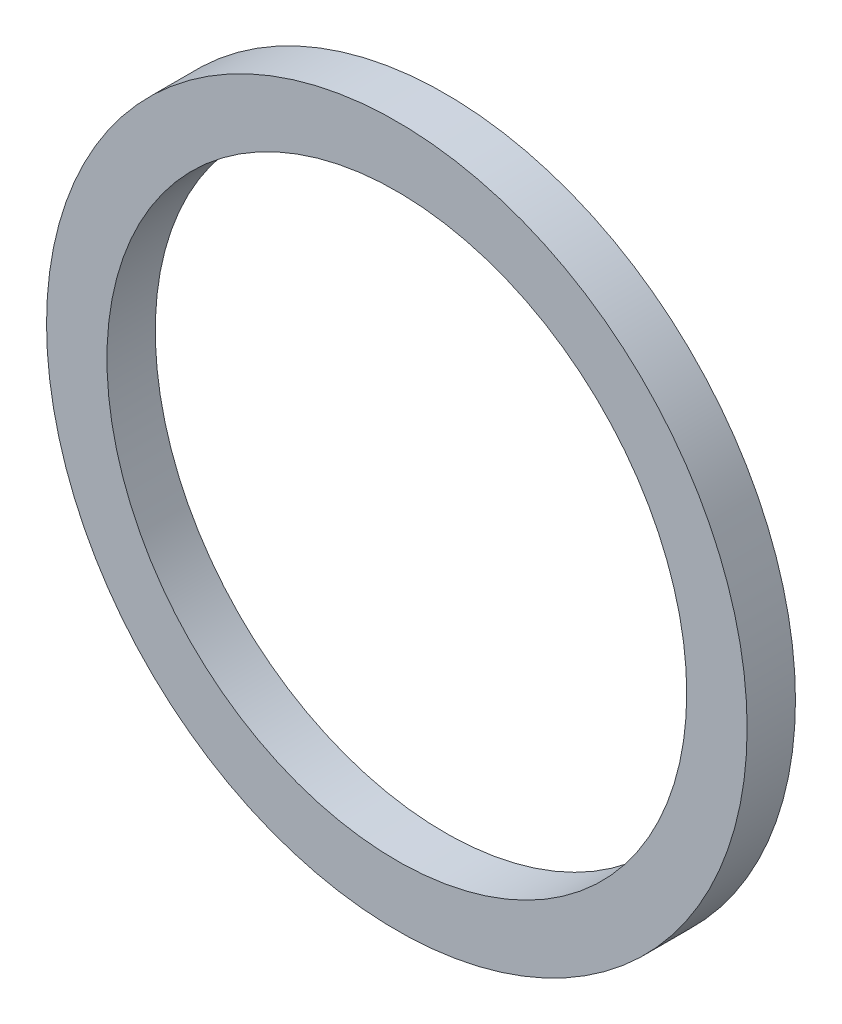
ISO-10303-21;
HEADER;
FILE_DESCRIPTION(('STEP AP214'),'2;1');
FILE_NAME('part.step','',(''),(''),'','','');
FILE_SCHEMA(('AUTOMOTIVE_DESIGN { 1 0 10303 214 1 1 1 1 }'));
ENDSEC;
DATA;
#1=APPLICATION_CONTEXT('core data for automotive mechanical design processes');
#2=APPLICATION_PROTOCOL_DEFINITION('international standard','automotive_design',2000,#1);
#3=PRODUCT_CONTEXT('',#1,'mechanical');
#4=PRODUCT('Part','Part','',(#3));
#5=PRODUCT_RELATED_PRODUCT_CATEGORY('part','',(#4));
#6=PRODUCT_DEFINITION_FORMATION('','',#4);
#7=PRODUCT_DEFINITION_CONTEXT('part definition',#1,'design');
#8=PRODUCT_DEFINITION('design','',#6,#7);
#9=PRODUCT_DEFINITION_SHAPE('','',#8);
#10=(LENGTH_UNIT() NAMED_UNIT(*) SI_UNIT(.MILLI.,.METRE.));
#11=(NAMED_UNIT(*) PLANE_ANGLE_UNIT() SI_UNIT($,.RADIAN.));
#12=(NAMED_UNIT(*) SI_UNIT($,.STERADIAN.) SOLID_ANGLE_UNIT());
#13=UNCERTAINTY_MEASURE_WITH_UNIT(LENGTH_MEASURE(1.E-05),#10,'distance_accuracy_value','');
#14=(GEOMETRIC_REPRESENTATION_CONTEXT(3) GLOBAL_UNCERTAINTY_ASSIGNED_CONTEXT((#13)) GLOBAL_UNIT_ASSIGNED_CONTEXT((#10,
#11,#12)) REPRESENTATION_CONTEXT('',''));
#15=CARTESIAN_POINT('',(0.,0.,0.));
#16=DIRECTION('',(0.,0.,1.));
#17=DIRECTION('',(1.,0.,0.));
#18=AXIS2_PLACEMENT_3D('',#15,#16,#17);
#19=CARTESIAN_POINT('',(0.,0.,10.));
#20=DIRECTION('',(0.,0.,1.));
#21=DIRECTION('',(1.,0.,0.));
#22=AXIS2_PLACEMENT_3D('',#19,#20,#21);
#23=PLANE('',#22);
#24=CARTESIAN_POINT('',(0.,0.,10.));
#25=DIRECTION('',(0.,0.,1.));
#26=DIRECTION('',(1.,0.,0.));
#27=AXIS2_PLACEMENT_3D('',#24,#25,#26);
#28=CIRCLE('',#27,72.5);
#29=CARTESIAN_POINT('',(72.5,0.,10.));
#30=VERTEX_POINT('',#29);
#31=EDGE_CURVE('E10',#30,#30,#28,.T.);
#32=ORIENTED_EDGE('',*,*,#31,.T.);
#33=EDGE_LOOP('',(#32));
#34=FACE_BOUND('',#33,.T.);
#35=CARTESIAN_POINT('',(0.,0.,10.));
#36=DIRECTION('',(0.,0.,1.));
#37=DIRECTION('',(1.,0.,0.));
#38=AXIS2_PLACEMENT_3D('',#35,#36,#37);
#39=CIRCLE('',#38,60.);
#40=CARTESIAN_POINT('',(60.,0.,10.));
#41=VERTEX_POINT('',#40);
#42=EDGE_CURVE('E42',#41,#41,#39,.T.);
#43=ORIENTED_EDGE('',*,*,#42,.F.);
#44=EDGE_LOOP('',(#43));
#45=FACE_BOUND('',#44,.T.);
#46=ADVANCED_FACE('F31',(#34,#45),#23,.T.);
#47=CARTESIAN_POINT('',(0.,0.,0.));
#48=DIRECTION('',(0.,0.,1.));
#49=DIRECTION('',(1.,0.,0.));
#50=AXIS2_PLACEMENT_3D('',#47,#48,#49);
#51=PLANE('',#50);
#52=CARTESIAN_POINT('',(0.,0.,0.));
#53=DIRECTION('',(0.,0.,1.));
#54=DIRECTION('',(1.,0.,0.));
#55=AXIS2_PLACEMENT_3D('',#52,#53,#54);
#56=CIRCLE('',#55,72.5);
#57=CARTESIAN_POINT('',(72.5,0.,0.));
#58=VERTEX_POINT('',#57);
#59=EDGE_CURVE('E35',#58,#58,#56,.T.);
#60=ORIENTED_EDGE('',*,*,#59,.F.);
#61=EDGE_LOOP('',(#60));
#62=FACE_BOUND('',#61,.T.);
#63=CARTESIAN_POINT('',(0.,0.,0.));
#64=DIRECTION('',(0.,0.,1.));
#65=DIRECTION('',(1.,0.,0.));
#66=AXIS2_PLACEMENT_3D('',#63,#64,#65);
#67=CIRCLE('',#66,60.);
#68=CARTESIAN_POINT('',(60.,0.,0.));
#69=VERTEX_POINT('',#68);
#70=EDGE_CURVE('E44',#69,#69,#67,.T.);
#71=ORIENTED_EDGE('',*,*,#70,.T.);
#72=EDGE_LOOP('',(#71));
#73=FACE_BOUND('',#72,.T.);
#74=ADVANCED_FACE('F54',(#62,#73),#51,.F.);
#75=CARTESIAN_POINT('',(0.,0.,10.));
#76=DIRECTION('',(0.,0.,-1.));
#77=DIRECTION('',(-1.,0.,0.));
#78=AXIS2_PLACEMENT_3D('',#75,#76,#77);
#79=CYLINDRICAL_SURFACE('',#78,72.5);
#80=ORIENTED_EDGE('',*,*,#31,.F.);
#81=EDGE_LOOP('',(#80));
#82=FACE_BOUND('',#81,.T.);
#83=ORIENTED_EDGE('',*,*,#59,.T.);
#84=EDGE_LOOP('',(#83));
#85=FACE_BOUND('',#84,.T.);
#86=ADVANCED_FACE('F33',(#82,#85),#79,.T.);
#87=CARTESIAN_POINT('',(0.,0.,10.));
#88=DIRECTION('',(0.,0.,-1.));
#89=DIRECTION('',(-1.,0.,0.));
#90=AXIS2_PLACEMENT_3D('',#87,#88,#89);
#91=CYLINDRICAL_SURFACE('',#90,60.);
#92=ORIENTED_EDGE('',*,*,#42,.T.);
#93=EDGE_LOOP('',(#92));
#94=FACE_BOUND('',#93,.T.);
#95=ORIENTED_EDGE('',*,*,#70,.F.);
#96=EDGE_LOOP('',(#95));
#97=FACE_BOUND('',#96,.T.);
#98=ADVANCED_FACE('F50',(#94,#97),#91,.F.);
#99=CLOSED_SHELL('',(#46,#74,#86,#98));
#100=MANIFOLD_SOLID_BREP('B2',#99);
#101=ADVANCED_BREP_SHAPE_REPRESENTATION('',(#18,#100),#14);
#102=SHAPE_DEFINITION_REPRESENTATION(#9,#101);
ENDSEC;
END-ISO-10303-21;
